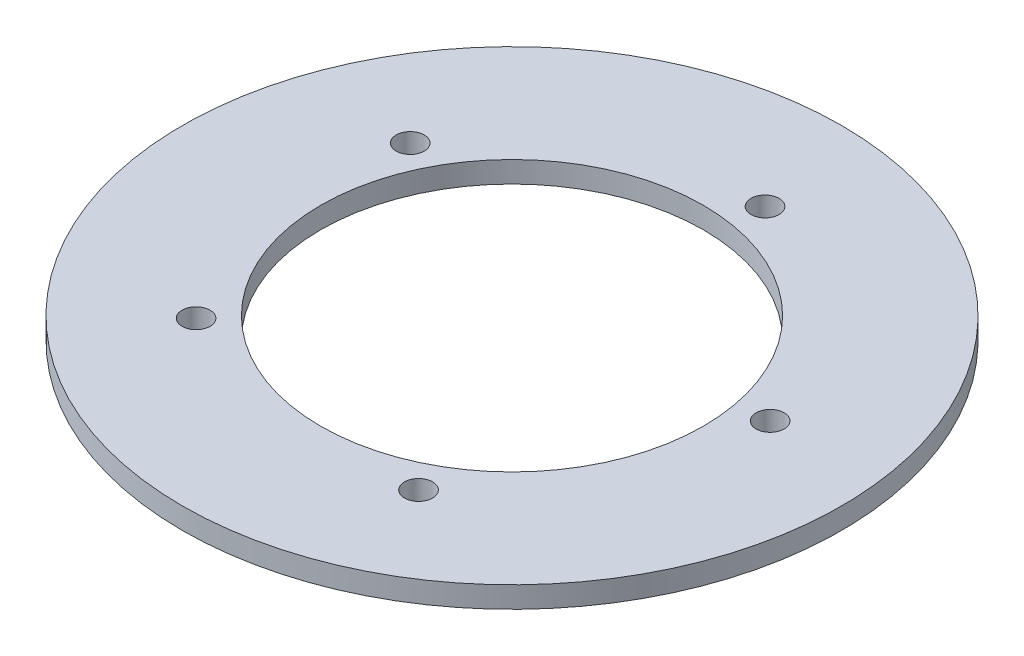
ISO-10303-21;
HEADER;
FILE_DESCRIPTION(('STEP AP214'),'2;1');
FILE_NAME('part.step','',(''),(''),'','','');
FILE_SCHEMA(('AUTOMOTIVE_DESIGN { 1 0 10303 214 1 1 1 1 }'));
ENDSEC;
DATA;
#1=APPLICATION_CONTEXT('core data for automotive mechanical design processes');
#2=APPLICATION_PROTOCOL_DEFINITION('international standard','automotive_design',2000,#1);
#3=PRODUCT_CONTEXT('',#1,'mechanical');
#4=PRODUCT('Part','Part','',(#3));
#5=PRODUCT_RELATED_PRODUCT_CATEGORY('part','',(#4));
#6=PRODUCT_DEFINITION_FORMATION('','',#4);
#7=PRODUCT_DEFINITION_CONTEXT('part definition',#1,'design');
#8=PRODUCT_DEFINITION('design','',#6,#7);
#9=PRODUCT_DEFINITION_SHAPE('','',#8);
#10=(LENGTH_UNIT() NAMED_UNIT(*) SI_UNIT(.MILLI.,.METRE.));
#11=(NAMED_UNIT(*) PLANE_ANGLE_UNIT() SI_UNIT($,.RADIAN.));
#12=(NAMED_UNIT(*) SI_UNIT($,.STERADIAN.) SOLID_ANGLE_UNIT());
#13=UNCERTAINTY_MEASURE_WITH_UNIT(LENGTH_MEASURE(1.E-05),#10,'distance_accuracy_value','');
#14=(GEOMETRIC_REPRESENTATION_CONTEXT(3) GLOBAL_UNCERTAINTY_ASSIGNED_CONTEXT((#13)) GLOBAL_UNIT_ASSIGNED_CONTEXT((#10,
#11,#12)) REPRESENTATION_CONTEXT('',''));
#15=CARTESIAN_POINT('',(0.,0.,0.));
#16=DIRECTION('',(0.,0.,1.));
#17=DIRECTION('',(1.,0.,0.));
#18=AXIS2_PLACEMENT_3D('',#15,#16,#17);
#19=CARTESIAN_POINT('',(0.,5.,0.));
#20=DIRECTION('',(0.,1.,0.));
#21=DIRECTION('',(0.,0.,1.));
#22=AXIS2_PLACEMENT_3D('',#19,#20,#21);
#23=PLANE('',#22);
#24=CARTESIAN_POINT('',(7.49999999999999,5.,-52.));
#25=DIRECTION('',(0.,1.,0.));
#26=DIRECTION('',(0.,0.,1.));
#27=AXIS2_PLACEMENT_3D('',#24,#25,#26);
#28=CIRCLE('',#27,3.29999999999999);
#29=CARTESIAN_POINT('',(7.49999999999999,5.,-48.7));
#30=VERTEX_POINT('',#29);
#31=EDGE_CURVE('E75',#30,#30,#28,.T.);
#32=ORIENTED_EDGE('',*,*,#31,.F.);
#33=EDGE_LOOP('',(#32));
#34=FACE_BOUND('',#33,.T.);
#35=CARTESIAN_POINT('',(51.7725663051602,5.,-8.93595983528274));
#36=DIRECTION('',(0.,1.,0.));
#37=DIRECTION('',(0.,0.,1.));
#38=AXIS2_PLACEMENT_3D('',#35,#36,#37);
#39=CIRCLE('',#38,3.29999999999999);
#40=CARTESIAN_POINT('',(51.7725663051602,5.,-5.63595983528275));
#41=VERTEX_POINT('',#40);
#42=EDGE_CURVE('E69',#41,#41,#39,.T.);
#43=ORIENTED_EDGE('',*,*,#42,.F.);
#44=EDGE_LOOP('',(#43));
#45=FACE_BOUND('',#44,.T.);
#46=CARTESIAN_POINT('',(24.4972056613956,5.,46.4772730996913));
#47=DIRECTION('',(0.,1.,0.));
#48=DIRECTION('',(0.,0.,1.));
#49=AXIS2_PLACEMENT_3D('',#46,#47,#48);
#50=CIRCLE('',#49,3.29999999999999);
#51=CARTESIAN_POINT('',(24.4972056613956,5.,49.7772730996913));
#52=VERTEX_POINT('',#51);
#53=EDGE_CURVE('E63',#52,#52,#50,.T.);
#54=ORIENTED_EDGE('',*,*,#53,.F.);
#55=EDGE_LOOP('',(#54));
#56=FACE_BOUND('',#55,.T.);
#57=CARTESIAN_POINT('',(-36.6324605770207,5.,37.6604943153037));
#58=DIRECTION('',(0.,1.,0.));
#59=DIRECTION('',(0.,0.,1.));
#60=AXIS2_PLACEMENT_3D('',#57,#58,#59);
#61=CIRCLE('',#60,3.29999999999999);
#62=CARTESIAN_POINT('',(-36.6324605770207,5.,40.9604943153037));
#63=VERTEX_POINT('',#62);
#64=EDGE_CURVE('E57',#63,#63,#61,.T.);
#65=ORIENTED_EDGE('',*,*,#64,.F.);
#66=EDGE_LOOP('',(#65));
#67=FACE_BOUND('',#66,.T.);
#68=CARTESIAN_POINT('',(-47.1373113895356,5.,-23.2018075797114));
#69=DIRECTION('',(0.,1.,0.));
#70=DIRECTION('',(0.,0.,1.));
#71=AXIS2_PLACEMENT_3D('',#68,#69,#70);
#72=CIRCLE('',#71,3.29999999999999);
#73=CARTESIAN_POINT('',(-47.1373113895356,5.,-19.9018075797114));
#74=VERTEX_POINT('',#73);
#75=EDGE_CURVE('E51',#74,#74,#72,.T.);
#76=ORIENTED_EDGE('',*,*,#75,.F.);
#77=EDGE_LOOP('',(#76));
#78=FACE_BOUND('',#77,.T.);
#79=CARTESIAN_POINT('',(0.,5.,0.));
#80=DIRECTION('',(0.,1.,0.));
#81=DIRECTION('',(0.,0.,1.));
#82=AXIS2_PLACEMENT_3D('',#79,#80,#81);
#83=CIRCLE('',#82,77.5);
#84=CARTESIAN_POINT('',(0.,5.,77.5));
#85=VERTEX_POINT('',#84);
#86=EDGE_CURVE('E10',#85,#85,#83,.T.);
#87=ORIENTED_EDGE('',*,*,#86,.T.);
#88=EDGE_LOOP('',(#87));
#89=FACE_BOUND('',#88,.T.);
#90=CARTESIAN_POINT('',(0.,5.,0.));
#91=DIRECTION('',(0.,1.,0.));
#92=DIRECTION('',(0.,0.,1.));
#93=AXIS2_PLACEMENT_3D('',#90,#91,#92);
#94=CIRCLE('',#93,45.);
#95=CARTESIAN_POINT('',(0.,5.,45.));
#96=VERTEX_POINT('',#95);
#97=EDGE_CURVE('E41',#96,#96,#94,.T.);
#98=ORIENTED_EDGE('',*,*,#97,.F.);
#99=EDGE_LOOP('',(#98));
#100=FACE_BOUND('',#99,.T.);
#101=ADVANCED_FACE('F30',(#34,#45,#56,#67,#78,#89,#100),#23,.T.);
#102=CARTESIAN_POINT('',(0.,0.,0.));
#103=DIRECTION('',(0.,1.,0.));
#104=DIRECTION('',(0.,0.,1.));
#105=AXIS2_PLACEMENT_3D('',#102,#103,#104);
#106=PLANE('',#105);
#107=CARTESIAN_POINT('',(7.49999999999999,0.,-52.));
#108=DIRECTION('',(0.,1.,0.));
#109=DIRECTION('',(0.,0.,1.));
#110=AXIS2_PLACEMENT_3D('',#107,#108,#109);
#111=CIRCLE('',#110,3.3);
#112=CARTESIAN_POINT('',(7.49999999999999,0.,-48.7));
#113=VERTEX_POINT('',#112);
#114=EDGE_CURVE('E72',#113,#113,#111,.T.);
#115=ORIENTED_EDGE('',*,*,#114,.T.);
#116=EDGE_LOOP('',(#115));
#117=FACE_BOUND('',#116,.T.);
#118=CARTESIAN_POINT('',(51.7725663051602,0.,-8.93595983528274));
#119=DIRECTION('',(0.,1.,0.));
#120=DIRECTION('',(0.,0.,1.));
#121=AXIS2_PLACEMENT_3D('',#118,#119,#120);
#122=CIRCLE('',#121,3.3);
#123=CARTESIAN_POINT('',(51.7725663051602,0.,-5.63595983528274));
#124=VERTEX_POINT('',#123);
#125=EDGE_CURVE('E66',#124,#124,#122,.T.);
#126=ORIENTED_EDGE('',*,*,#125,.T.);
#127=EDGE_LOOP('',(#126));
#128=FACE_BOUND('',#127,.T.);
#129=CARTESIAN_POINT('',(24.4972056613956,0.,46.4772730996913));
#130=DIRECTION('',(0.,1.,0.));
#131=DIRECTION('',(0.,0.,1.));
#132=AXIS2_PLACEMENT_3D('',#129,#130,#131);
#133=CIRCLE('',#132,3.3);
#134=CARTESIAN_POINT('',(24.4972056613956,0.,49.7772730996913));
#135=VERTEX_POINT('',#134);
#136=EDGE_CURVE('E60',#135,#135,#133,.T.);
#137=ORIENTED_EDGE('',*,*,#136,.T.);
#138=EDGE_LOOP('',(#137));
#139=FACE_BOUND('',#138,.T.);
#140=CARTESIAN_POINT('',(-36.6324605770207,0.,37.6604943153037));
#141=DIRECTION('',(0.,1.,0.));
#142=DIRECTION('',(0.,0.,1.));
#143=AXIS2_PLACEMENT_3D('',#140,#141,#142);
#144=CIRCLE('',#143,3.3);
#145=CARTESIAN_POINT('',(-36.6324605770207,0.,40.9604943153037));
#146=VERTEX_POINT('',#145);
#147=EDGE_CURVE('E54',#146,#146,#144,.T.);
#148=ORIENTED_EDGE('',*,*,#147,.T.);
#149=EDGE_LOOP('',(#148));
#150=FACE_BOUND('',#149,.T.);
#151=CARTESIAN_POINT('',(-47.1373113895356,0.,-23.2018075797114));
#152=DIRECTION('',(0.,1.,0.));
#153=DIRECTION('',(0.,0.,1.));
#154=AXIS2_PLACEMENT_3D('',#151,#152,#153);
#155=CIRCLE('',#154,3.3);
#156=CARTESIAN_POINT('',(-47.1373113895356,0.,-19.9018075797114));
#157=VERTEX_POINT('',#156);
#158=EDGE_CURVE('E46',#157,#157,#155,.T.);
#159=ORIENTED_EDGE('',*,*,#158,.T.);
#160=EDGE_LOOP('',(#159));
#161=FACE_BOUND('',#160,.T.);
#162=CARTESIAN_POINT('',(0.,0.,0.));
#163=DIRECTION('',(0.,1.,0.));
#164=DIRECTION('',(0.,0.,1.));
#165=AXIS2_PLACEMENT_3D('',#162,#163,#164);
#166=CIRCLE('',#165,77.5);
#167=CARTESIAN_POINT('',(0.,0.,77.5));
#168=VERTEX_POINT('',#167);
#169=EDGE_CURVE('E34',#168,#168,#166,.T.);
#170=ORIENTED_EDGE('',*,*,#169,.F.);
#171=EDGE_LOOP('',(#170));
#172=FACE_BOUND('',#171,.T.);
#173=CARTESIAN_POINT('',(0.,0.,0.));
#174=DIRECTION('',(0.,1.,0.));
#175=DIRECTION('',(0.,0.,1.));
#176=AXIS2_PLACEMENT_3D('',#173,#174,#175);
#177=CIRCLE('',#176,45.);
#178=CARTESIAN_POINT('',(0.,0.,45.));
#179=VERTEX_POINT('',#178);
#180=EDGE_CURVE('E43',#179,#179,#177,.T.);
#181=ORIENTED_EDGE('',*,*,#180,.T.);
#182=EDGE_LOOP('',(#181));
#183=FACE_BOUND('',#182,.T.);
#184=ADVANCED_FACE('F83',(#117,#128,#139,#150,#161,#172,#183),#106,.F.);
#185=CARTESIAN_POINT('',(0.,5.,0.));
#186=DIRECTION('',(0.,-1.,0.));
#187=DIRECTION('',(0.,0.,-1.));
#188=AXIS2_PLACEMENT_3D('',#185,#186,#187);
#189=CYLINDRICAL_SURFACE('',#188,77.5);
#190=ORIENTED_EDGE('',*,*,#86,.F.);
#191=EDGE_LOOP('',(#190));
#192=FACE_BOUND('',#191,.T.);
#193=ORIENTED_EDGE('',*,*,#169,.T.);
#194=EDGE_LOOP('',(#193));
#195=FACE_BOUND('',#194,.T.);
#196=ADVANCED_FACE('F32',(#192,#195),#189,.T.);
#197=CARTESIAN_POINT('',(0.,5.,0.));
#198=DIRECTION('',(0.,-1.,0.));
#199=DIRECTION('',(0.,0.,-1.));
#200=AXIS2_PLACEMENT_3D('',#197,#198,#199);
#201=CYLINDRICAL_SURFACE('',#200,45.);
#202=ORIENTED_EDGE('',*,*,#97,.T.);
#203=EDGE_LOOP('',(#202));
#204=FACE_BOUND('',#203,.T.);
#205=ORIENTED_EDGE('',*,*,#180,.F.);
#206=EDGE_LOOP('',(#205));
#207=FACE_BOUND('',#206,.T.);
#208=ADVANCED_FACE('F95',(#204,#207),#201,.F.);
#209=CARTESIAN_POINT('',(-47.1373113895356,5.,-23.2018075797114));
#210=DIRECTION('',(0.,1.,0.));
#211=DIRECTION('',(0.,0.,1.));
#212=AXIS2_PLACEMENT_3D('',#209,#210,#211);
#213=CYLINDRICAL_SURFACE('',#212,3.29999999999999);
#214=ORIENTED_EDGE('',*,*,#158,.F.);
#215=EDGE_LOOP('',(#214));
#216=FACE_BOUND('',#215,.T.);
#217=ORIENTED_EDGE('',*,*,#75,.T.);
#218=EDGE_LOOP('',(#217));
#219=FACE_BOUND('',#218,.T.);
#220=ADVANCED_FACE('F98',(#216,#219),#213,.F.);
#221=CARTESIAN_POINT('',(-36.6324605770207,5.,37.6604943153037));
#222=DIRECTION('',(0.,1.,0.));
#223=DIRECTION('',(0.,0.,1.));
#224=AXIS2_PLACEMENT_3D('',#221,#222,#223);
#225=CYLINDRICAL_SURFACE('',#224,3.29999999999999);
#226=ORIENTED_EDGE('',*,*,#147,.F.);
#227=EDGE_LOOP('',(#226));
#228=FACE_BOUND('',#227,.T.);
#229=ORIENTED_EDGE('',*,*,#64,.T.);
#230=EDGE_LOOP('',(#229));
#231=FACE_BOUND('',#230,.T.);
#232=ADVANCED_FACE('F112',(#228,#231),#225,.F.);
#233=CARTESIAN_POINT('',(24.4972056613956,5.,46.4772730996913));
#234=DIRECTION('',(0.,1.,0.));
#235=DIRECTION('',(0.,0.,1.));
#236=AXIS2_PLACEMENT_3D('',#233,#234,#235);
#237=CYLINDRICAL_SURFACE('',#236,3.29999999999999);
#238=ORIENTED_EDGE('',*,*,#136,.F.);
#239=EDGE_LOOP('',(#238));
#240=FACE_BOUND('',#239,.T.);
#241=ORIENTED_EDGE('',*,*,#53,.T.);
#242=EDGE_LOOP('',(#241));
#243=FACE_BOUND('',#242,.T.);
#244=ADVANCED_FACE('F116',(#240,#243),#237,.F.);
#245=CARTESIAN_POINT('',(51.7725663051602,5.,-8.93595983528274));
#246=DIRECTION('',(0.,1.,0.));
#247=DIRECTION('',(0.,0.,1.));
#248=AXIS2_PLACEMENT_3D('',#245,#246,#247);
#249=CYLINDRICAL_SURFACE('',#248,3.29999999999999);
#250=ORIENTED_EDGE('',*,*,#125,.F.);
#251=EDGE_LOOP('',(#250));
#252=FACE_BOUND('',#251,.T.);
#253=ORIENTED_EDGE('',*,*,#42,.T.);
#254=EDGE_LOOP('',(#253));
#255=FACE_BOUND('',#254,.T.);
#256=ADVANCED_FACE('F120',(#252,#255),#249,.F.);
#257=CARTESIAN_POINT('',(7.49999999999999,5.,-52.));
#258=DIRECTION('',(0.,1.,0.));
#259=DIRECTION('',(0.,0.,1.));
#260=AXIS2_PLACEMENT_3D('',#257,#258,#259);
#261=CYLINDRICAL_SURFACE('',#260,3.29999999999999);
#262=ORIENTED_EDGE('',*,*,#114,.F.);
#263=EDGE_LOOP('',(#262));
#264=FACE_BOUND('',#263,.T.);
#265=ORIENTED_EDGE('',*,*,#31,.T.);
#266=EDGE_LOOP('',(#265));
#267=FACE_BOUND('',#266,.T.);
#268=ADVANCED_FACE('F79',(#264,#267),#261,.F.);
#269=CLOSED_SHELL('',(#101,#184,#196,#208,#220,#232,#244,#256,#268));
#270=MANIFOLD_SOLID_BREP('B2',#269);
#271=ADVANCED_BREP_SHAPE_REPRESENTATION('',(#18,#270),#14);
#272=SHAPE_DEFINITION_REPRESENTATION(#9,#271);
ENDSEC;
END-ISO-10303-21;
